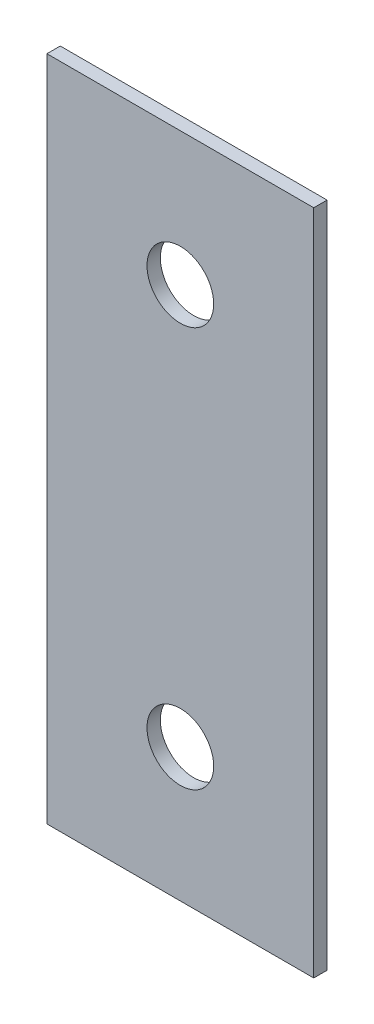
ISO-10303-21;
HEADER;
FILE_DESCRIPTION(('STEP AP214'),'2;1');
FILE_NAME('part.step','',(''),(''),'','','');
FILE_SCHEMA(('AUTOMOTIVE_DESIGN { 1 0 10303 214 1 1 1 1 }'));
ENDSEC;
DATA;
#1=APPLICATION_CONTEXT('core data for automotive mechanical design processes');
#2=APPLICATION_PROTOCOL_DEFINITION('international standard','automotive_design',2000,#1);
#3=PRODUCT_CONTEXT('',#1,'mechanical');
#4=PRODUCT('Part','Part','',(#3));
#5=PRODUCT_RELATED_PRODUCT_CATEGORY('part','',(#4));
#6=PRODUCT_DEFINITION_FORMATION('','',#4);
#7=PRODUCT_DEFINITION_CONTEXT('part definition',#1,'design');
#8=PRODUCT_DEFINITION('design','',#6,#7);
#9=PRODUCT_DEFINITION_SHAPE('','',#8);
#10=(LENGTH_UNIT() NAMED_UNIT(*) SI_UNIT(.MILLI.,.METRE.));
#11=(NAMED_UNIT(*) PLANE_ANGLE_UNIT() SI_UNIT($,.RADIAN.));
#12=(NAMED_UNIT(*) SI_UNIT($,.STERADIAN.) SOLID_ANGLE_UNIT());
#13=UNCERTAINTY_MEASURE_WITH_UNIT(LENGTH_MEASURE(1.E-05),#10,'distance_accuracy_value','');
#14=(GEOMETRIC_REPRESENTATION_CONTEXT(3) GLOBAL_UNCERTAINTY_ASSIGNED_CONTEXT((#13)) GLOBAL_UNIT_ASSIGNED_CONTEXT((#10,
#11,#12)) REPRESENTATION_CONTEXT('',''));
#15=CARTESIAN_POINT('',(0.,0.,0.));
#16=DIRECTION('',(0.,0.,1.));
#17=DIRECTION('',(1.,0.,0.));
#18=AXIS2_PLACEMENT_3D('',#15,#16,#17);
#19=CARTESIAN_POINT('',(0.,0.,1.));
#20=DIRECTION('',(0.,0.,1.));
#21=DIRECTION('',(1.,0.,0.));
#22=AXIS2_PLACEMENT_3D('',#19,#20,#21);
#23=PLANE('',#22);
#24=CARTESIAN_POINT('',(0.,15.,1.));
#25=DIRECTION('',(0.,0.,1.));
#26=DIRECTION('',(1.,0.,0.));
#27=AXIS2_PLACEMENT_3D('',#24,#25,#26);
#28=CIRCLE('',#27,2.5);
#29=CARTESIAN_POINT('',(2.5,15.,1.));
#30=VERTEX_POINT('',#29);
#31=EDGE_CURVE('E103',#30,#30,#28,.T.);
#32=ORIENTED_EDGE('',*,*,#31,.F.);
#33=EDGE_LOOP('',(#32));
#34=FACE_BOUND('',#33,.T.);
#35=DIRECTION('',(0.,-1.,0.));
#36=VECTOR('',#35,1.);
#37=CARTESIAN_POINT('',(-10.,-25.,1.));
#38=LINE('',#37,#36);
#39=CARTESIAN_POINT('',(-10.,25.,1.));
#40=VERTEX_POINT('',#39);
#41=CARTESIAN_POINT('',(-10.,-25.,1.));
#42=VERTEX_POINT('',#41);
#43=EDGE_CURVE('E88',#40,#42,#38,.T.);
#44=ORIENTED_EDGE('',*,*,#43,.T.);
#45=DIRECTION('',(1.,0.,0.));
#46=VECTOR('',#45,1.);
#47=CARTESIAN_POINT('',(10.,-25.,1.));
#48=LINE('',#47,#46);
#49=CARTESIAN_POINT('',(10.,-25.,1.));
#50=VERTEX_POINT('',#49);
#51=EDGE_CURVE('E83',#42,#50,#48,.T.);
#52=ORIENTED_EDGE('',*,*,#51,.T.);
#53=DIRECTION('',(0.,1.,0.));
#54=VECTOR('',#53,1.);
#55=CARTESIAN_POINT('',(10.,-25.,1.));
#56=LINE('',#55,#54);
#57=CARTESIAN_POINT('',(10.,25.,1.));
#58=VERTEX_POINT('',#57);
#59=EDGE_CURVE('E86',#50,#58,#56,.T.);
#60=ORIENTED_EDGE('',*,*,#59,.T.);
#61=DIRECTION('',(-1.,0.,0.));
#62=VECTOR('',#61,1.);
#63=CARTESIAN_POINT('',(10.,25.,1.));
#64=LINE('',#63,#62);
#65=EDGE_CURVE('E53',#58,#40,#64,.T.);
#66=ORIENTED_EDGE('',*,*,#65,.T.);
#67=EDGE_LOOP('',(#44,#52,#60,#66));
#68=FACE_BOUND('',#67,.T.);
#69=CARTESIAN_POINT('',(0.,-15.,1.));
#70=DIRECTION('',(0.,0.,1.));
#71=DIRECTION('',(1.,0.,0.));
#72=AXIS2_PLACEMENT_3D('',#69,#70,#71);
#73=CIRCLE('',#72,2.5);
#74=CARTESIAN_POINT('',(2.5,-15.,1.));
#75=VERTEX_POINT('',#74);
#76=EDGE_CURVE('E118',#75,#75,#73,.T.);
#77=ORIENTED_EDGE('',*,*,#76,.F.);
#78=EDGE_LOOP('',(#77));
#79=FACE_BOUND('',#78,.T.);
#80=ADVANCED_FACE('F36',(#34,#68,#79),#23,.T.);
#81=CARTESIAN_POINT('',(0.,0.,0.));
#82=DIRECTION('',(0.,0.,1.));
#83=DIRECTION('',(1.,0.,0.));
#84=AXIS2_PLACEMENT_3D('',#81,#82,#83);
#85=PLANE('',#84);
#86=DIRECTION('',(0.,-1.,0.));
#87=VECTOR('',#86,1.);
#88=CARTESIAN_POINT('',(-10.,-25.,0.));
#89=LINE('',#88,#87);
#90=CARTESIAN_POINT('',(-10.,25.,0.));
#91=VERTEX_POINT('',#90);
#92=CARTESIAN_POINT('',(-10.,-25.,0.));
#93=VERTEX_POINT('',#92);
#94=EDGE_CURVE('E100',#91,#93,#89,.T.);
#95=ORIENTED_EDGE('',*,*,#94,.F.);
#96=DIRECTION('',(-1.,0.,0.));
#97=VECTOR('',#96,1.);
#98=CARTESIAN_POINT('',(10.,25.,0.));
#99=LINE('',#98,#97);
#100=CARTESIAN_POINT('',(10.,25.,0.));
#101=VERTEX_POINT('',#100);
#102=EDGE_CURVE('E76',#101,#91,#99,.T.);
#103=ORIENTED_EDGE('',*,*,#102,.F.);
#104=DIRECTION('',(0.,1.,0.));
#105=VECTOR('',#104,1.);
#106=CARTESIAN_POINT('',(10.,-25.,0.));
#107=LINE('',#106,#105);
#108=CARTESIAN_POINT('',(10.,-25.,0.));
#109=VERTEX_POINT('',#108);
#110=EDGE_CURVE('E70',#109,#101,#107,.T.);
#111=ORIENTED_EDGE('',*,*,#110,.F.);
#112=DIRECTION('',(1.,0.,0.));
#113=VECTOR('',#112,1.);
#114=CARTESIAN_POINT('',(10.,-25.,0.));
#115=LINE('',#114,#113);
#116=EDGE_CURVE('E92',#93,#109,#115,.T.);
#117=ORIENTED_EDGE('',*,*,#116,.F.);
#118=EDGE_LOOP('',(#95,#103,#111,#117));
#119=FACE_BOUND('',#118,.T.);
#120=CARTESIAN_POINT('',(0.,15.,0.));
#121=DIRECTION('',(0.,0.,1.));
#122=DIRECTION('',(1.,0.,0.));
#123=AXIS2_PLACEMENT_3D('',#120,#121,#122);
#124=CIRCLE('',#123,2.5);
#125=CARTESIAN_POINT('',(2.5,15.,0.));
#126=VERTEX_POINT('',#125);
#127=EDGE_CURVE('E115',#126,#126,#124,.T.);
#128=ORIENTED_EDGE('',*,*,#127,.T.);
#129=EDGE_LOOP('',(#128));
#130=FACE_BOUND('',#129,.T.);
#131=CARTESIAN_POINT('',(0.,-15.,0.));
#132=DIRECTION('',(0.,0.,1.));
#133=DIRECTION('',(1.,0.,0.));
#134=AXIS2_PLACEMENT_3D('',#131,#132,#133);
#135=CIRCLE('',#134,2.5);
#136=CARTESIAN_POINT('',(2.5,-15.,0.));
#137=VERTEX_POINT('',#136);
#138=EDGE_CURVE('E121',#137,#137,#135,.T.);
#139=ORIENTED_EDGE('',*,*,#138,.T.);
#140=EDGE_LOOP('',(#139));
#141=FACE_BOUND('',#140,.T.);
#142=ADVANCED_FACE('F111',(#119,#130,#141),#85,.F.);
#143=CARTESIAN_POINT('',(-10.,-25.,1.));
#144=DIRECTION('',(1.,0.,0.));
#145=DIRECTION('',(0.,0.,-1.));
#146=AXIS2_PLACEMENT_3D('',#143,#144,#145);
#147=PLANE('',#146);
#148=ORIENTED_EDGE('',*,*,#94,.T.);
#149=DIRECTION('',(0.,0.,-1.));
#150=VECTOR('',#149,1.);
#151=CARTESIAN_POINT('',(-10.,-25.,1.));
#152=LINE('',#151,#150);
#153=EDGE_CURVE('E11',#42,#93,#152,.T.);
#154=ORIENTED_EDGE('',*,*,#153,.F.);
#155=ORIENTED_EDGE('',*,*,#43,.F.);
#156=DIRECTION('',(0.,0.,-1.));
#157=VECTOR('',#156,1.);
#158=CARTESIAN_POINT('',(-10.,25.,1.));
#159=LINE('',#158,#157);
#160=EDGE_CURVE('E96',#40,#91,#159,.T.);
#161=ORIENTED_EDGE('',*,*,#160,.T.);
#162=EDGE_LOOP('',(#148,#154,#155,#161));
#163=FACE_BOUND('',#162,.T.);
#164=ADVANCED_FACE('F38',(#163),#147,.F.);
#165=CARTESIAN_POINT('',(10.,-25.,1.));
#166=DIRECTION('',(0.,1.,0.));
#167=DIRECTION('',(-1.,0.,0.));
#168=AXIS2_PLACEMENT_3D('',#165,#166,#167);
#169=PLANE('',#168);
#170=ORIENTED_EDGE('',*,*,#116,.T.);
#171=DIRECTION('',(0.,0.,-1.));
#172=VECTOR('',#171,1.);
#173=CARTESIAN_POINT('',(10.,-25.,1.));
#174=LINE('',#173,#172);
#175=EDGE_CURVE('E45',#50,#109,#174,.T.);
#176=ORIENTED_EDGE('',*,*,#175,.F.);
#177=ORIENTED_EDGE('',*,*,#51,.F.);
#178=ORIENTED_EDGE('',*,*,#153,.T.);
#179=EDGE_LOOP('',(#170,#176,#177,#178));
#180=FACE_BOUND('',#179,.T.);
#181=ADVANCED_FACE('F91',(#180),#169,.F.);
#182=CARTESIAN_POINT('',(10.,-25.,1.));
#183=DIRECTION('',(-1.,0.,0.));
#184=DIRECTION('',(0.,0.,1.));
#185=AXIS2_PLACEMENT_3D('',#182,#183,#184);
#186=PLANE('',#185);
#187=ORIENTED_EDGE('',*,*,#110,.T.);
#188=DIRECTION('',(0.,0.,-1.));
#189=VECTOR('',#188,1.);
#190=CARTESIAN_POINT('',(10.,25.,1.));
#191=LINE('',#190,#189);
#192=EDGE_CURVE('E93',#58,#101,#191,.T.);
#193=ORIENTED_EDGE('',*,*,#192,.F.);
#194=ORIENTED_EDGE('',*,*,#59,.F.);
#195=ORIENTED_EDGE('',*,*,#175,.T.);
#196=EDGE_LOOP('',(#187,#193,#194,#195));
#197=FACE_BOUND('',#196,.T.);
#198=ADVANCED_FACE('F94',(#197),#186,.F.);
#199=CARTESIAN_POINT('',(10.,25.,1.));
#200=DIRECTION('',(0.,-1.,0.));
#201=DIRECTION('',(0.,0.,-1.));
#202=AXIS2_PLACEMENT_3D('',#199,#200,#201);
#203=PLANE('',#202);
#204=ORIENTED_EDGE('',*,*,#102,.T.);
#205=ORIENTED_EDGE('',*,*,#160,.F.);
#206=ORIENTED_EDGE('',*,*,#65,.F.);
#207=ORIENTED_EDGE('',*,*,#192,.T.);
#208=EDGE_LOOP('',(#204,#205,#206,#207));
#209=FACE_BOUND('',#208,.T.);
#210=ADVANCED_FACE('F108',(#209),#203,.F.);
#211=CARTESIAN_POINT('',(0.,15.,1.));
#212=DIRECTION('',(0.,0.,-1.));
#213=DIRECTION('',(-1.,0.,0.));
#214=AXIS2_PLACEMENT_3D('',#211,#212,#213);
#215=CYLINDRICAL_SURFACE('',#214,2.5);
#216=ORIENTED_EDGE('',*,*,#31,.T.);
#217=EDGE_LOOP('',(#216));
#218=FACE_BOUND('',#217,.T.);
#219=ORIENTED_EDGE('',*,*,#127,.F.);
#220=EDGE_LOOP('',(#219));
#221=FACE_BOUND('',#220,.T.);
#222=ADVANCED_FACE('F138',(#218,#221),#215,.F.);
#223=CARTESIAN_POINT('',(0.,-15.,1.));
#224=DIRECTION('',(0.,0.,-1.));
#225=DIRECTION('',(-1.,0.,0.));
#226=AXIS2_PLACEMENT_3D('',#223,#224,#225);
#227=CYLINDRICAL_SURFACE('',#226,2.5);
#228=ORIENTED_EDGE('',*,*,#76,.T.);
#229=EDGE_LOOP('',(#228));
#230=FACE_BOUND('',#229,.T.);
#231=ORIENTED_EDGE('',*,*,#138,.F.);
#232=EDGE_LOOP('',(#231));
#233=FACE_BOUND('',#232,.T.);
#234=ADVANCED_FACE('F127',(#230,#233),#227,.F.);
#235=CLOSED_SHELL('',(#80,#142,#164,#181,#198,#210,#222,#234));
#236=MANIFOLD_SOLID_BREP('B2',#235);
#237=ADVANCED_BREP_SHAPE_REPRESENTATION('',(#18,#236),#14);
#238=SHAPE_DEFINITION_REPRESENTATION(#9,#237);
ENDSEC;
END-ISO-10303-21;
